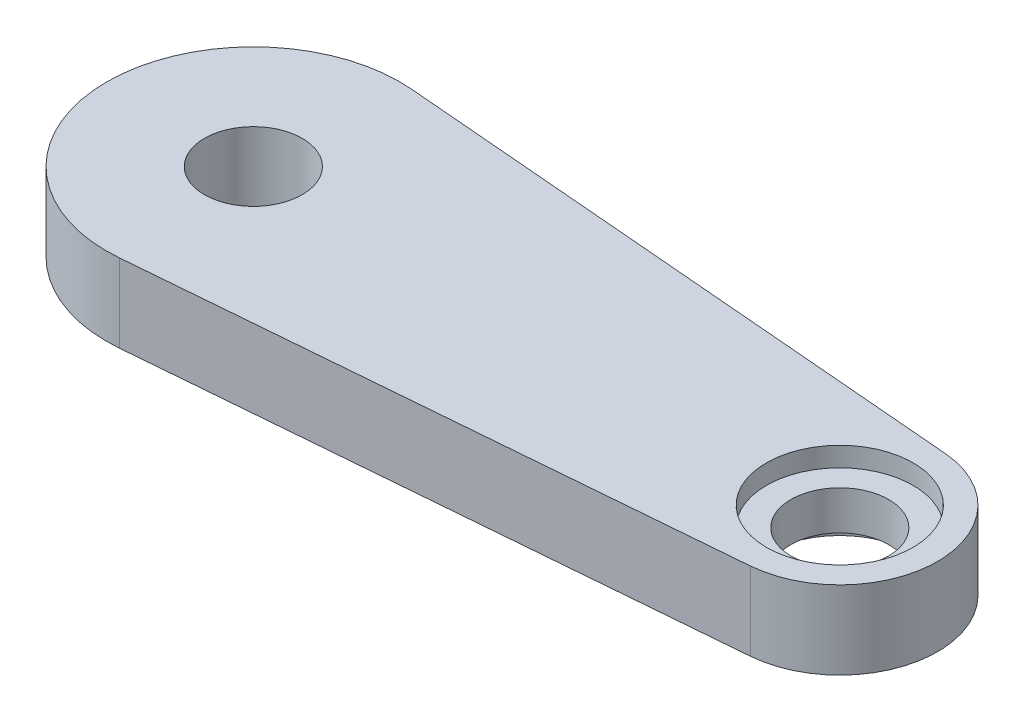
ISO-10303-21;
HEADER;
FILE_DESCRIPTION(('STEP AP214'),'2;1');
FILE_NAME('part.step','',(''),(''),'','','');
FILE_SCHEMA(('AUTOMOTIVE_DESIGN { 1 0 10303 214 1 1 1 1 }'));
ENDSEC;
DATA;
#1=APPLICATION_CONTEXT('core data for automotive mechanical design processes');
#2=APPLICATION_PROTOCOL_DEFINITION('international standard','automotive_design',2000,#1);
#3=PRODUCT_CONTEXT('',#1,'mechanical');
#4=PRODUCT('Part','Part','',(#3));
#5=PRODUCT_RELATED_PRODUCT_CATEGORY('part','',(#4));
#6=PRODUCT_DEFINITION_FORMATION('','',#4);
#7=PRODUCT_DEFINITION_CONTEXT('part definition',#1,'design');
#8=PRODUCT_DEFINITION('design','',#6,#7);
#9=PRODUCT_DEFINITION_SHAPE('','',#8);
#10=(LENGTH_UNIT() NAMED_UNIT(*) SI_UNIT(.MILLI.,.METRE.));
#11=(NAMED_UNIT(*) PLANE_ANGLE_UNIT() SI_UNIT($,.RADIAN.));
#12=(NAMED_UNIT(*) SI_UNIT($,.STERADIAN.) SOLID_ANGLE_UNIT());
#13=UNCERTAINTY_MEASURE_WITH_UNIT(LENGTH_MEASURE(1.E-05),#10,'distance_accuracy_value','');
#14=(GEOMETRIC_REPRESENTATION_CONTEXT(3) GLOBAL_UNCERTAINTY_ASSIGNED_CONTEXT((#13)) GLOBAL_UNIT_ASSIGNED_CONTEXT((#10,
#11,#12)) REPRESENTATION_CONTEXT('',''));
#15=CARTESIAN_POINT('',(0.,0.,0.));
#16=DIRECTION('',(0.,0.,1.));
#17=DIRECTION('',(1.,0.,0.));
#18=AXIS2_PLACEMENT_3D('',#15,#16,#17);
#19=CARTESIAN_POINT('',(0.,10.,0.));
#20=DIRECTION('',(0.,-1.,0.));
#21=DIRECTION('',(0.,0.,-1.));
#22=AXIS2_PLACEMENT_3D('',#19,#20,#21);
#23=PLANE('',#22);
#24=DIRECTION('',(0.707106781186548,0.,-0.707106781186547));
#25=VECTOR('',#24,1.);
#26=CARTESIAN_POINT('',(22.0710678118655,10.,-20.));
#27=LINE('',#26,#25);
#28=CARTESIAN_POINT('',(15.,10.,-12.9289321881345));
#29=VERTEX_POINT('',#28);
#30=CARTESIAN_POINT('',(22.0710678118655,10.,-20.));
#31=VERTEX_POINT('',#30);
#32=EDGE_CURVE('E55',#29,#31,#27,.T.);
#33=ORIENTED_EDGE('',*,*,#32,.T.);
#34=DIRECTION('',(-0.707106781186548,0.,-0.707106781186547));
#35=VECTOR('',#34,1.);
#36=CARTESIAN_POINT('',(22.0710678118655,10.,-20.));
#37=LINE('',#36,#35);
#38=CARTESIAN_POINT('',(15.,10.,-27.0710678118655));
#39=VERTEX_POINT('',#38);
#40=EDGE_CURVE('E66',#31,#39,#37,.T.);
#41=ORIENTED_EDGE('',*,*,#40,.T.);
#42=DIRECTION('',(-0.707106781186547,0.,0.707106781186548));
#43=VECTOR('',#42,1.);
#44=CARTESIAN_POINT('',(15.,10.,-27.0710678118655));
#45=LINE('',#44,#43);
#46=CARTESIAN_POINT('',(7.92893218813453,10.,-20.));
#47=VERTEX_POINT('',#46);
#48=EDGE_CURVE('E51',#39,#47,#45,.T.);
#49=ORIENTED_EDGE('',*,*,#48,.T.);
#50=DIRECTION('',(0.707106781186548,0.,0.707106781186547));
#51=VECTOR('',#50,1.);
#52=CARTESIAN_POINT('',(15.,10.,-12.9289321881345));
#53=LINE('',#52,#51);
#54=EDGE_CURVE('E12',#47,#29,#53,.T.);
#55=ORIENTED_EDGE('',*,*,#54,.T.);
#56=EDGE_LOOP('',(#33,#41,#49,#55));
#57=FACE_BOUND('',#56,.T.);
#58=ADVANCED_FACE('F46',(#57),#23,.F.);
#59=OPEN_SHELL('',(#58));
#60=SHELL_BASED_SURFACE_MODEL('B2',(#59));
#61=CARTESIAN_POINT('',(0.,10.,0.));
#62=DIRECTION('',(0.,-1.,0.));
#63=DIRECTION('',(0.,0.,-1.));
#64=AXIS2_PLACEMENT_3D('',#61,#62,#63);
#65=PLANE('',#64);
#66=DIRECTION('',(0.707106781186547,0.,-0.707106781186548));
#67=VECTOR('',#66,1.);
#68=CARTESIAN_POINT('',(-7.92893218813453,10.,-20.));
#69=LINE('',#68,#67);
#70=CARTESIAN_POINT('',(-15.,10.,-12.9289321881345));
#71=VERTEX_POINT('',#70);
#72=CARTESIAN_POINT('',(-7.92893218813453,10.,-20.));
#73=VERTEX_POINT('',#72);
#74=EDGE_CURVE('E109',#71,#73,#69,.T.);
#75=ORIENTED_EDGE('',*,*,#74,.T.);
#76=DIRECTION('',(-0.707106781186547,0.,-0.707106781186548));
#77=VECTOR('',#76,1.);
#78=CARTESIAN_POINT('',(-7.92893218813453,10.,-20.));
#79=LINE('',#78,#77);
#80=CARTESIAN_POINT('',(-15.,10.,-27.0710678118655));
#81=VERTEX_POINT('',#80);
#82=EDGE_CURVE('E120',#73,#81,#79,.T.);
#83=ORIENTED_EDGE('',*,*,#82,.T.);
#84=DIRECTION('',(-0.707106781186548,0.,0.707106781186547));
#85=VECTOR('',#84,1.);
#86=CARTESIAN_POINT('',(-15.,10.,-27.0710678118655));
#87=LINE('',#86,#85);
#88=CARTESIAN_POINT('',(-22.0710678118655,10.,-20.));
#89=VERTEX_POINT('',#88);
#90=EDGE_CURVE('E105',#81,#89,#87,.T.);
#91=ORIENTED_EDGE('',*,*,#90,.T.);
#92=DIRECTION('',(0.707106781186547,0.,0.707106781186548));
#93=VECTOR('',#92,1.);
#94=CARTESIAN_POINT('',(-15.,10.,-12.9289321881345));
#95=LINE('',#94,#93);
#96=EDGE_CURVE('E44',#89,#71,#95,.T.);
#97=ORIENTED_EDGE('',*,*,#96,.T.);
#98=EDGE_LOOP('',(#75,#83,#91,#97));
#99=FACE_BOUND('',#98,.T.);
#100=ADVANCED_FACE('F100',(#99),#65,.F.);
#101=OPEN_SHELL('',(#100));
#102=SHELL_BASED_SURFACE_MODEL('B6',(#101));
#103=CARTESIAN_POINT('',(0.,10.,0.));
#104=DIRECTION('',(0.,-1.,0.));
#105=DIRECTION('',(0.,0.,-1.));
#106=AXIS2_PLACEMENT_3D('',#103,#104,#105);
#107=PLANE('',#106);
#108=DIRECTION('',(0.,0.,-1.));
#109=VECTOR('',#108,1.);
#110=CARTESIAN_POINT('',(5.,10.,-15.));
#111=LINE('',#110,#109);
#112=CARTESIAN_POINT('',(5.,10.,-15.));
#113=VERTEX_POINT('',#112);
#114=CARTESIAN_POINT('',(5.,10.,-25.));
#115=VERTEX_POINT('',#114);
#116=EDGE_CURVE('E162',#113,#115,#111,.T.);
#117=ORIENTED_EDGE('',*,*,#116,.T.);
#118=DIRECTION('',(-1.,0.,0.));
#119=VECTOR('',#118,1.);
#120=CARTESIAN_POINT('',(-5.,10.,-25.));
#121=LINE('',#120,#119);
#122=CARTESIAN_POINT('',(-5.,10.,-25.));
#123=VERTEX_POINT('',#122);
#124=EDGE_CURVE('E173',#115,#123,#121,.T.);
#125=ORIENTED_EDGE('',*,*,#124,.T.);
#126=DIRECTION('',(0.,0.,1.));
#127=VECTOR('',#126,1.);
#128=CARTESIAN_POINT('',(-5.,10.,-15.));
#129=LINE('',#128,#127);
#130=CARTESIAN_POINT('',(-5.,10.,-15.));
#131=VERTEX_POINT('',#130);
#132=EDGE_CURVE('E158',#123,#131,#129,.T.);
#133=ORIENTED_EDGE('',*,*,#132,.T.);
#134=DIRECTION('',(1.,0.,0.));
#135=VECTOR('',#134,1.);
#136=CARTESIAN_POINT('',(-5.,10.,-15.));
#137=LINE('',#136,#135);
#138=EDGE_CURVE('E98',#131,#113,#137,.T.);
#139=ORIENTED_EDGE('',*,*,#138,.T.);
#140=EDGE_LOOP('',(#117,#125,#133,#139));
#141=FACE_BOUND('',#140,.T.);
#142=ADVANCED_FACE('F153',(#141),#107,.F.);
#143=OPEN_SHELL('',(#142));
#144=SHELL_BASED_SURFACE_MODEL('B38',(#143));
#145=CARTESIAN_POINT('',(75.,10.,0.));
#146=DIRECTION('',(0.,-1.,0.));
#147=DIRECTION('',(0.,0.,-1.));
#148=AXIS2_PLACEMENT_3D('',#145,#146,#147);
#149=CYLINDRICAL_SURFACE('',#148,18.75);
#150=CARTESIAN_POINT('',(75.,-10.,0.));
#151=DIRECTION('',(0.,1.,0.));
#152=DIRECTION('',(0.,0.,1.));
#153=AXIS2_PLACEMENT_3D('',#150,#151,#152);
#154=CIRCLE('',#153,18.75);
#155=CARTESIAN_POINT('',(75.,-10.,18.75));
#156=VERTEX_POINT('',#155);
#157=EDGE_CURVE('E262',#156,#156,#154,.T.);
#158=ORIENTED_EDGE('',*,*,#157,.F.);
#159=EDGE_LOOP('',(#158));
#160=FACE_BOUND('',#159,.T.);
#161=CARTESIAN_POINT('',(75.,-5.,0.));
#162=DIRECTION('',(0.,1.,0.));
#163=DIRECTION('',(0.,0.,1.));
#164=AXIS2_PLACEMENT_3D('',#161,#162,#163);
#165=CIRCLE('',#164,18.75);
#166=CARTESIAN_POINT('',(75.,-5.,18.75));
#167=VERTEX_POINT('',#166);
#168=EDGE_CURVE('E324',#167,#167,#165,.T.);
#169=ORIENTED_EDGE('',*,*,#168,.T.);
#170=EDGE_LOOP('',(#169));
#171=FACE_BOUND('',#170,.T.);
#172=ADVANCED_FACE('F196',(#160,#171),#149,.F.);
#173=CARTESIAN_POINT('',(2.60416666666666,10.,31.1413040184932));
#174=DIRECTION('',(-0.0833333333333333,0.,-0.996521728591783));
#175=DIRECTION('',(-0.996521728591783,0.,0.0833333333333333));
#176=AXIS2_PLACEMENT_3D('',#173,#174,#175);
#177=PLANE('',#176);
#178=DIRECTION('',(0.996521728591783,0.,-0.0833333333333333));
#179=VECTOR('',#178,1.);
#180=CARTESIAN_POINT('',(2.60416666666666,-10.,31.1413040184932));
#181=LINE('',#180,#179);
#182=CARTESIAN_POINT('',(-71.875,-10.,37.3695648221918));
#183=VERTEX_POINT('',#182);
#184=CARTESIAN_POINT('',(77.0833333333333,-10.,24.9130432147946));
#185=VERTEX_POINT('',#184);
#186=EDGE_CURVE('E269',#183,#185,#181,.T.);
#187=ORIENTED_EDGE('',*,*,#186,.T.);
#188=DIRECTION('',(0.,-1.,0.));
#189=VECTOR('',#188,1.);
#190=CARTESIAN_POINT('',(77.0833333333333,10.,24.9130432147946));
#191=LINE('',#190,#189);
#192=CARTESIAN_POINT('',(77.0833333333333,10.,24.9130432147946));
#193=VERTEX_POINT('',#192);
#194=EDGE_CURVE('E205',#193,#185,#191,.T.);
#195=ORIENTED_EDGE('',*,*,#194,.F.);
#196=DIRECTION('',(0.996521728591783,0.,-0.0833333333333333));
#197=VECTOR('',#196,1.);
#198=CARTESIAN_POINT('',(2.60416666666666,10.,31.1413040184932));
#199=LINE('',#198,#197);
#200=CARTESIAN_POINT('',(-71.875,10.,37.3695648221918));
#201=VERTEX_POINT('',#200);
#202=EDGE_CURVE('E245',#201,#193,#199,.T.);
#203=ORIENTED_EDGE('',*,*,#202,.F.);
#204=DIRECTION('',(0.,-1.,0.));
#205=VECTOR('',#204,1.);
#206=CARTESIAN_POINT('',(-71.875,10.,37.3695648221918));
#207=LINE('',#206,#205);
#208=EDGE_CURVE('E258',#201,#183,#207,.T.);
#209=ORIENTED_EDGE('',*,*,#208,.T.);
#210=EDGE_LOOP('',(#187,#195,#203,#209));
#211=FACE_BOUND('',#210,.T.);
#212=ADVANCED_FACE('F280',(#211),#177,.F.);
#213=CARTESIAN_POINT('',(75.,10.,0.));
#214=DIRECTION('',(0.,-1.,0.));
#215=DIRECTION('',(0.,0.,-1.));
#216=AXIS2_PLACEMENT_3D('',#213,#214,#215);
#217=CYLINDRICAL_SURFACE('',#216,25.);
#218=CARTESIAN_POINT('',(75.,-10.,0.));
#219=DIRECTION('',(0.,1.,0.));
#220=DIRECTION('',(0.,0.,1.));
#221=AXIS2_PLACEMENT_3D('',#218,#219,#220);
#222=CIRCLE('',#221,25.);
#223=CARTESIAN_POINT('',(77.0833333333333,-10.,-24.9130432147946));
#224=VERTEX_POINT('',#223);
#225=EDGE_CURVE('E251',#185,#224,#222,.T.);
#226=ORIENTED_EDGE('',*,*,#225,.T.);
#227=DIRECTION('',(0.,-1.,0.));
#228=VECTOR('',#227,1.);
#229=CARTESIAN_POINT('',(77.0833333333333,10.,-24.9130432147946));
#230=LINE('',#229,#228);
#231=CARTESIAN_POINT('',(77.0833333333333,10.,-24.9130432147946));
#232=VERTEX_POINT('',#231);
#233=EDGE_CURVE('E249',#232,#224,#230,.T.);
#234=ORIENTED_EDGE('',*,*,#233,.F.);
#235=CARTESIAN_POINT('',(75.,10.,0.));
#236=DIRECTION('',(0.,1.,0.));
#237=DIRECTION('',(0.,0.,1.));
#238=AXIS2_PLACEMENT_3D('',#235,#236,#237);
#239=CIRCLE('',#238,25.);
#240=EDGE_CURVE('E240',#193,#232,#239,.T.);
#241=ORIENTED_EDGE('',*,*,#240,.F.);
#242=ORIENTED_EDGE('',*,*,#194,.T.);
#243=EDGE_LOOP('',(#226,#234,#241,#242));
#244=FACE_BOUND('',#243,.T.);
#245=ADVANCED_FACE('F250',(#244),#217,.T.);
#246=CARTESIAN_POINT('',(2.60416666666667,10.,-31.1413040184932));
#247=DIRECTION('',(0.0833333333333334,0.,-0.996521728591783));
#248=DIRECTION('',(-0.996521728591783,0.,-0.0833333333333334));
#249=AXIS2_PLACEMENT_3D('',#246,#247,#248);
#250=PLANE('',#249);
#251=DIRECTION('',(0.996521728591783,0.,0.0833333333333334));
#252=VECTOR('',#251,1.);
#253=CARTESIAN_POINT('',(2.60416666666667,-10.,-31.1413040184932));
#254=LINE('',#253,#252);
#255=CARTESIAN_POINT('',(-71.875,-10.,-37.3695648221918));
#256=VERTEX_POINT('',#255);
#257=EDGE_CURVE('E273',#256,#224,#254,.T.);
#258=ORIENTED_EDGE('',*,*,#257,.F.);
#259=DIRECTION('',(0.,-1.,0.));
#260=VECTOR('',#259,1.);
#261=CARTESIAN_POINT('',(-71.875,10.,-37.3695648221918));
#262=LINE('',#261,#260);
#263=CARTESIAN_POINT('',(-71.875,10.,-37.3695648221918));
#264=VERTEX_POINT('',#263);
#265=EDGE_CURVE('E229',#264,#256,#262,.T.);
#266=ORIENTED_EDGE('',*,*,#265,.F.);
#267=DIRECTION('',(0.996521728591783,0.,0.0833333333333334));
#268=VECTOR('',#267,1.);
#269=CARTESIAN_POINT('',(2.60416666666667,10.,-31.1413040184932));
#270=LINE('',#269,#268);
#271=EDGE_CURVE('E243',#264,#232,#270,.T.);
#272=ORIENTED_EDGE('',*,*,#271,.T.);
#273=ORIENTED_EDGE('',*,*,#233,.T.);
#274=EDGE_LOOP('',(#258,#266,#272,#273));
#275=FACE_BOUND('',#274,.T.);
#276=ADVANCED_FACE('F256',(#275),#250,.T.);
#277=CARTESIAN_POINT('',(-75.,10.,0.));
#278=DIRECTION('',(0.,-1.,0.));
#279=DIRECTION('',(0.,0.,-1.));
#280=AXIS2_PLACEMENT_3D('',#277,#278,#279);
#281=CYLINDRICAL_SURFACE('',#280,12.5);
#282=CARTESIAN_POINT('',(-75.,10.,0.));
#283=DIRECTION('',(0.,1.,0.));
#284=DIRECTION('',(0.,0.,1.));
#285=AXIS2_PLACEMENT_3D('',#282,#283,#284);
#286=CIRCLE('',#285,12.5);
#287=CARTESIAN_POINT('',(-75.,10.,12.5));
#288=VERTEX_POINT('',#287);
#289=EDGE_CURVE('E319',#288,#288,#286,.T.);
#290=ORIENTED_EDGE('',*,*,#289,.T.);
#291=EDGE_LOOP('',(#290));
#292=FACE_BOUND('',#291,.T.);
#293=CARTESIAN_POINT('',(-75.,-10.,0.));
#294=DIRECTION('',(0.,1.,0.));
#295=DIRECTION('',(0.,0.,1.));
#296=AXIS2_PLACEMENT_3D('',#293,#294,#295);
#297=CIRCLE('',#296,12.5);
#298=CARTESIAN_POINT('',(-75.,-10.,12.5));
#299=VERTEX_POINT('',#298);
#300=EDGE_CURVE('E265',#299,#299,#297,.T.);
#301=ORIENTED_EDGE('',*,*,#300,.F.);
#302=EDGE_LOOP('',(#301));
#303=FACE_BOUND('',#302,.T.);
#304=ADVANCED_FACE('F308',(#292,#303),#281,.F.);
#305=CARTESIAN_POINT('',(75.,5.,0.));
#306=DIRECTION('',(0.,1.,0.));
#307=DIRECTION('',(0.,0.,1.));
#308=AXIS2_PLACEMENT_3D('',#305,#306,#307);
#309=CIRCLE('',#308,18.75);
#310=CARTESIAN_POINT('',(75.,5.,18.75));
#311=VERTEX_POINT('',#310);
#312=EDGE_CURVE('E151',#311,#311,#309,.T.);
#313=ORIENTED_EDGE('',*,*,#312,.F.);
#314=EDGE_LOOP('',(#313));
#315=FACE_BOUND('',#314,.T.);
#316=CARTESIAN_POINT('',(75.,10.,0.));
#317=DIRECTION('',(0.,1.,0.));
#318=DIRECTION('',(0.,0.,1.));
#319=AXIS2_PLACEMENT_3D('',#316,#317,#318);
#320=CIRCLE('',#319,18.75);
#321=CARTESIAN_POINT('',(75.,10.,18.75));
#322=VERTEX_POINT('',#321);
#323=EDGE_CURVE('E276',#322,#322,#320,.T.);
#324=ORIENTED_EDGE('',*,*,#323,.T.);
#325=EDGE_LOOP('',(#324));
#326=FACE_BOUND('',#325,.T.);
#327=ADVANCED_FACE('F198',(#315,#326),#149,.F.);
#328=CARTESIAN_POINT('',(-75.,10.,0.));
#329=DIRECTION('',(0.,-1.,0.));
#330=DIRECTION('',(0.,0.,-1.));
#331=AXIS2_PLACEMENT_3D('',#328,#329,#330);
#332=CYLINDRICAL_SURFACE('',#331,37.5);
#333=CARTESIAN_POINT('',(-75.,-10.,0.));
#334=DIRECTION('',(0.,1.,0.));
#335=DIRECTION('',(0.,0.,1.));
#336=AXIS2_PLACEMENT_3D('',#333,#334,#335);
#337=CIRCLE('',#336,37.5);
#338=EDGE_CURVE('E232',#256,#183,#337,.T.);
#339=ORIENTED_EDGE('',*,*,#338,.T.);
#340=ORIENTED_EDGE('',*,*,#208,.F.);
#341=CARTESIAN_POINT('',(-75.,10.,0.));
#342=DIRECTION('',(0.,1.,0.));
#343=DIRECTION('',(0.,0.,1.));
#344=AXIS2_PLACEMENT_3D('',#341,#342,#343);
#345=CIRCLE('',#344,37.5);
#346=EDGE_CURVE('E213',#264,#201,#345,.T.);
#347=ORIENTED_EDGE('',*,*,#346,.F.);
#348=ORIENTED_EDGE('',*,*,#265,.T.);
#349=EDGE_LOOP('',(#339,#340,#347,#348));
#350=FACE_BOUND('',#349,.T.);
#351=ADVANCED_FACE('F294',(#350),#332,.T.);
#352=CARTESIAN_POINT('',(0.,10.,0.));
#353=DIRECTION('',(0.,1.,0.));
#354=DIRECTION('',(0.,0.,1.));
#355=AXIS2_PLACEMENT_3D('',#352,#353,#354);
#356=PLANE('',#355);
#357=ORIENTED_EDGE('',*,*,#323,.F.);
#358=EDGE_LOOP('',(#357));
#359=FACE_BOUND('',#358,.T.);
#360=ORIENTED_EDGE('',*,*,#289,.F.);
#361=EDGE_LOOP('',(#360));
#362=FACE_BOUND('',#361,.T.);
#363=ORIENTED_EDGE('',*,*,#202,.T.);
#364=ORIENTED_EDGE('',*,*,#240,.T.);
#365=ORIENTED_EDGE('',*,*,#271,.F.);
#366=ORIENTED_EDGE('',*,*,#346,.T.);
#367=EDGE_LOOP('',(#363,#364,#365,#366));
#368=FACE_BOUND('',#367,.T.);
#369=ADVANCED_FACE('F241',(#359,#362,#368),#356,.T.);
#370=CARTESIAN_POINT('',(0.,-10.,0.));
#371=DIRECTION('',(0.,1.,0.));
#372=DIRECTION('',(0.,0.,1.));
#373=AXIS2_PLACEMENT_3D('',#370,#371,#372);
#374=PLANE('',#373);
#375=ORIENTED_EDGE('',*,*,#157,.T.);
#376=EDGE_LOOP('',(#375));
#377=FACE_BOUND('',#376,.T.);
#378=ORIENTED_EDGE('',*,*,#300,.T.);
#379=EDGE_LOOP('',(#378));
#380=FACE_BOUND('',#379,.T.);
#381=ORIENTED_EDGE('',*,*,#186,.F.);
#382=ORIENTED_EDGE('',*,*,#338,.F.);
#383=ORIENTED_EDGE('',*,*,#257,.T.);
#384=ORIENTED_EDGE('',*,*,#225,.F.);
#385=EDGE_LOOP('',(#381,#382,#383,#384));
#386=FACE_BOUND('',#385,.T.);
#387=ADVANCED_FACE('F282',(#377,#380,#386),#374,.F.);
#388=CARTESIAN_POINT('',(75.,5.,0.));
#389=DIRECTION('',(0.,-1.,0.));
#390=DIRECTION('',(0.,0.,-1.));
#391=AXIS2_PLACEMENT_3D('',#388,#389,#390);
#392=CYLINDRICAL_SURFACE('',#391,12.5);
#393=CARTESIAN_POINT('',(75.,5.,0.));
#394=DIRECTION('',(0.,1.,0.));
#395=DIRECTION('',(0.,0.,1.));
#396=AXIS2_PLACEMENT_3D('',#393,#394,#395);
#397=CIRCLE('',#396,12.5);
#398=CARTESIAN_POINT('',(75.,5.,12.5));
#399=VERTEX_POINT('',#398);
#400=EDGE_CURVE('E266',#399,#399,#397,.T.);
#401=ORIENTED_EDGE('',*,*,#400,.T.);
#402=EDGE_LOOP('',(#401));
#403=FACE_BOUND('',#402,.T.);
#404=CARTESIAN_POINT('',(75.,-5.,0.));
#405=DIRECTION('',(0.,1.,0.));
#406=DIRECTION('',(0.,0.,1.));
#407=AXIS2_PLACEMENT_3D('',#404,#405,#406);
#408=CIRCLE('',#407,12.5);
#409=CARTESIAN_POINT('',(75.,-5.,12.5));
#410=VERTEX_POINT('',#409);
#411=EDGE_CURVE('E327',#410,#410,#408,.T.);
#412=ORIENTED_EDGE('',*,*,#411,.F.);
#413=EDGE_LOOP('',(#412));
#414=FACE_BOUND('',#413,.T.);
#415=ADVANCED_FACE('F284',(#403,#414),#392,.F.);
#416=CARTESIAN_POINT('',(0.,5.,0.));
#417=DIRECTION('',(0.,1.,0.));
#418=DIRECTION('',(0.,0.,1.));
#419=AXIS2_PLACEMENT_3D('',#416,#417,#418);
#420=PLANE('',#419);
#421=ORIENTED_EDGE('',*,*,#400,.F.);
#422=EDGE_LOOP('',(#421));
#423=FACE_BOUND('',#422,.T.);
#424=ORIENTED_EDGE('',*,*,#312,.T.);
#425=EDGE_LOOP('',(#424));
#426=FACE_BOUND('',#425,.T.);
#427=ADVANCED_FACE('F291',(#423,#426),#420,.T.);
#428=CARTESIAN_POINT('',(0.,-5.,0.));
#429=DIRECTION('',(0.,1.,0.));
#430=DIRECTION('',(0.,0.,1.));
#431=AXIS2_PLACEMENT_3D('',#428,#429,#430);
#432=PLANE('',#431);
#433=ORIENTED_EDGE('',*,*,#411,.T.);
#434=EDGE_LOOP('',(#433));
#435=FACE_BOUND('',#434,.T.);
#436=ORIENTED_EDGE('',*,*,#168,.F.);
#437=EDGE_LOOP('',(#436));
#438=FACE_BOUND('',#437,.T.);
#439=ADVANCED_FACE('F336',(#435,#438),#432,.F.);
#440=CLOSED_SHELL('',(#172,#212,#245,#276,#304,#327,#351,#369,#387,#415,#427,#439));
#441=MANIFOLD_SOLID_BREP('B92',#440);
#442=ADVANCED_BREP_SHAPE_REPRESENTATION('',(#18,#441),#14);
#443=MANIFOLD_SURFACE_SHAPE_REPRESENTATION('',(#18,#60,#102,#144),#14);
#444=SHAPE_REPRESENTATION('',(#18),#14);
#445=SHAPE_DEFINITION_REPRESENTATION(#9,#444);
#446=SHAPE_REPRESENTATION_RELATIONSHIP('','',#444,#442);
#447=SHAPE_REPRESENTATION_RELATIONSHIP('','',#444,#443);
ENDSEC;
END-ISO-10303-21;
